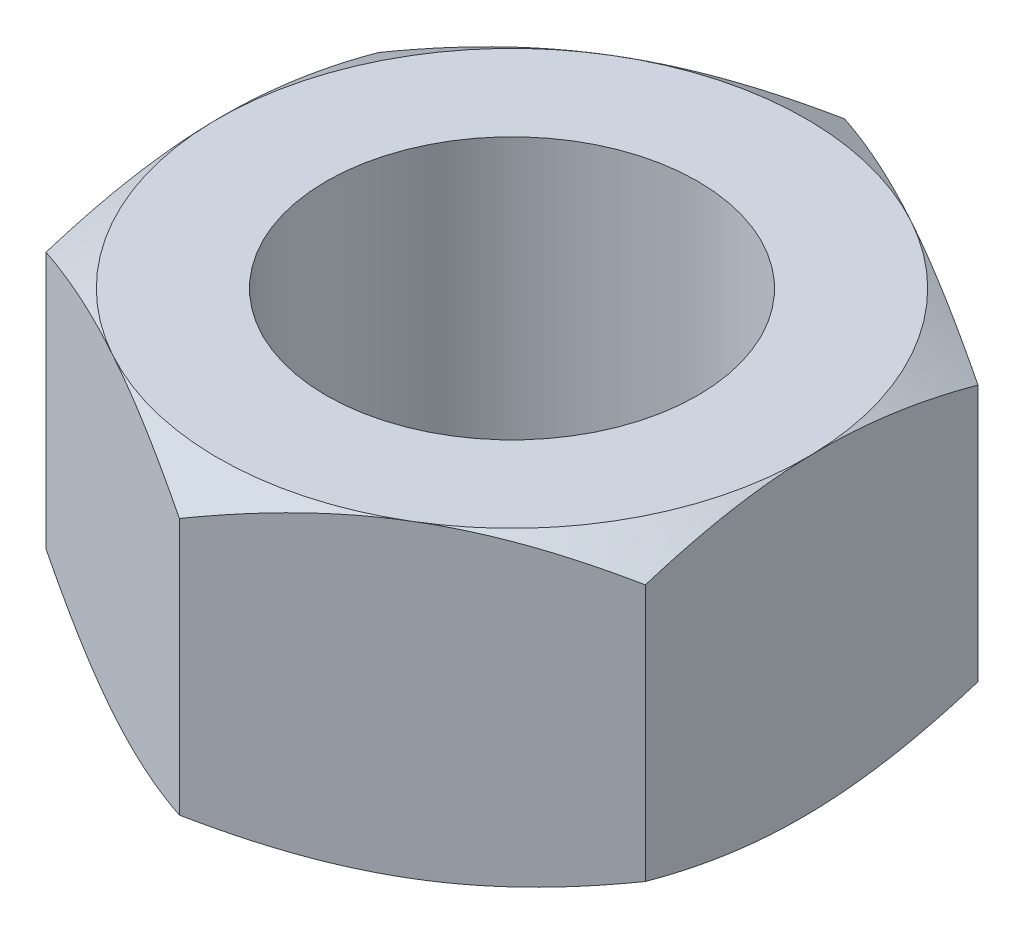
ISO-10303-21;
HEADER;
FILE_DESCRIPTION(('STEP AP214'),'2;1');
FILE_NAME('part.step','',(''),(''),'','','');
FILE_SCHEMA(('AUTOMOTIVE_DESIGN { 1 0 10303 214 1 1 1 1 }'));
ENDSEC;
DATA;
#1=APPLICATION_CONTEXT('core data for automotive mechanical design processes');
#2=APPLICATION_PROTOCOL_DEFINITION('international standard','automotive_design',2000,#1);
#3=PRODUCT_CONTEXT('',#1,'mechanical');
#4=PRODUCT('Part','Part','',(#3));
#5=PRODUCT_RELATED_PRODUCT_CATEGORY('part','',(#4));
#6=PRODUCT_DEFINITION_FORMATION('','',#4);
#7=PRODUCT_DEFINITION_CONTEXT('part definition',#1,'design');
#8=PRODUCT_DEFINITION('design','',#6,#7);
#9=PRODUCT_DEFINITION_SHAPE('','',#8);
#10=(LENGTH_UNIT() NAMED_UNIT(*) SI_UNIT(.MILLI.,.METRE.));
#11=(NAMED_UNIT(*) PLANE_ANGLE_UNIT() SI_UNIT($,.RADIAN.));
#12=(NAMED_UNIT(*) SI_UNIT($,.STERADIAN.) SOLID_ANGLE_UNIT());
#13=UNCERTAINTY_MEASURE_WITH_UNIT(LENGTH_MEASURE(1.E-05),#10,'distance_accuracy_value','');
#14=(GEOMETRIC_REPRESENTATION_CONTEXT(3) GLOBAL_UNCERTAINTY_ASSIGNED_CONTEXT((#13)) GLOBAL_UNIT_ASSIGNED_CONTEXT((#10,
#11,#12)) REPRESENTATION_CONTEXT('',''));
#15=CARTESIAN_POINT('',(0.,0.,0.));
#16=DIRECTION('',(0.,0.,1.));
#17=DIRECTION('',(1.,0.,0.));
#18=AXIS2_PLACEMENT_3D('',#15,#16,#17);
#19=CARTESIAN_POINT('',(0.216875664848166,10.,10.9675110339279));
#20=DIRECTION('',(-0.517024035207365,0.,-0.855970879772141));
#21=DIRECTION('',(-0.855970879772141,0.,0.517024035207365));
#22=AXIS2_PLACEMENT_3D('',#19,#20,#21);
#23=PLANE('',#22);
#24=CARTESIAN_POINT('',(9.60678100409177,0.848573226865303,5.29581487762493));
#25=CARTESIAN_POINT('',(9.40037473120608,0.778974190042007,5.42048851620465));
#26=CARTESIAN_POINT('',(9.1931988678912,0.712534024586031,5.5456270032489));
#27=CARTESIAN_POINT('',(8.7771857435893,0.586847930121857,5.79690749573838));
#28=CARTESIAN_POINT('',(8.56834796009741,0.527604367284288,5.92304981678729));
#29=CARTESIAN_POINT('',(7.93846959279282,0.361815083890065,6.30350931938198));
#30=CARTESIAN_POINT('',(7.51494247690453,0.267514877380496,6.55932841749732));
#31=CARTESIAN_POINT('',(6.88115353548772,0.156939031034355,6.9421499873717));
#32=CARTESIAN_POINT('',(6.67278520234029,0.125440116280293,7.06800875074691));
#33=CARTESIAN_POINT('',(6.25508380012184,0.0726184202625654,7.32030899785841));
#34=CARTESIAN_POINT('',(6.04575071256091,0.0512958348580953,7.44675049276298));
#35=CARTESIAN_POINT('',(5.62673535295866,0.0193731339503564,7.69984439718773));
#36=CARTESIAN_POINT('',(5.41705379387379,0.00876027643461872,7.82649637606754));
#37=CARTESIAN_POINT('',(4.99749699164288,-0.0015174559967477,8.07991732298792));
#38=CARTESIAN_POINT('',(4.78762175468121,-0.00118266915966374,8.20668628729299));
#39=CARTESIAN_POINT('',(4.39525467289056,0.0096732951475957,8.44368408325066));
#40=CARTESIAN_POINT('',(4.21273513521962,0.0188701791772939,8.55392964194996));
#41=CARTESIAN_POINT('',(3.84812293390536,0.0453652952509618,8.77416291864685));
#42=CARTESIAN_POINT('',(3.66603030137456,0.0626641003756451,8.88415061785184));
#43=CARTESIAN_POINT('',(3.12045797018203,0.126304408743109,9.21368753883417));
#44=CARTESIAN_POINT('',(2.75794397384888,0.184381876151889,9.43265345652194));
#45=CARTESIAN_POINT('',(2.02907057290985,0.329576142044076,9.8729079976684));
#46=CARTESIAN_POINT('',(1.66280418860713,0.417308400607521,10.0941404349488));
#47=CARTESIAN_POINT('',(0.935733335316184,0.616424218568323,10.5333062002026));
#48=CARTESIAN_POINT('',(0.574919555924859,0.727761012261039,10.7512451518513));
#49=CARTESIAN_POINT('',(0.216675664848164,0.848573226865303,10.9676318380457));
#50=B_SPLINE_CURVE_WITH_KNOTS('',3,(#24,#25,#26,#27,#28,#29,#30,#31,#32,#33,#34,#35,#36,#37,#38,
#39,#40,#41,#42,#43,#44,#45,#46,#47,#48,#49),.UNSPECIFIED.,.F.,.F.,(4,2,2,2,2,2,2,2,2,2,2,2,4),
(0.,0.752880596077925,1.50600806554758,3.01546907763463,3.75167382649358,4.48789274418008,
5.22323470119853,5.95855393851772,6.59868216032325,7.23885566775307,8.52011241106995,
9.82978447874759,11.1368856527152),.UNSPECIFIED.);
#51=CARTESIAN_POINT('',(9.60658100409177,0.848505776031884,5.29593568174279));
#52=VERTEX_POINT('',#51);
#53=CARTESIAN_POINT('',(4.91172833446997,0.,8.13172335783534));
#54=VERTEX_POINT('',#53);
#55=EDGE_CURVE('E128',#52,#54,#50,.T.);
#56=ORIENTED_EDGE('',*,*,#55,.F.);
#57=DIRECTION('',(0.,-1.,0.));
#58=VECTOR('',#57,1.);
#59=CARTESIAN_POINT('',(9.60658100409177,10.,5.29593568174279));
#60=LINE('',#59,#58);
#61=CARTESIAN_POINT('',(9.60658100409177,9.15149422396812,5.29593568174279));
#62=VERTEX_POINT('',#61);
#63=EDGE_CURVE('E333',#62,#52,#60,.T.);
#64=ORIENTED_EDGE('',*,*,#63,.F.);
#65=CARTESIAN_POINT('',(0.216675664848166,9.1514267731347,10.9676318380457));
#66=CARTESIAN_POINT('',(0.423081937733855,9.221025809958,10.842958199466));
#67=CARTESIAN_POINT('',(0.630257801048731,9.28746597541397,10.7178197124218));
#68=CARTESIAN_POINT('',(1.04627092535063,9.41315206987815,10.4665392199323));
#69=CARTESIAN_POINT('',(1.25510870884253,9.47239563271572,10.3403968988834));
#70=CARTESIAN_POINT('',(1.88498707614712,9.63818491610994,9.95993739628869));
#71=CARTESIAN_POINT('',(2.30851419203541,9.73248512261951,9.70411829817336));
#72=CARTESIAN_POINT('',(2.94230313345222,9.84306096896565,9.32129672829898));
#73=CARTESIAN_POINT('',(3.15067146659964,9.87455988371971,9.19543796492377));
#74=CARTESIAN_POINT('',(3.56837286881809,9.92738157973744,8.94313771781227));
#75=CARTESIAN_POINT('',(3.77770595637902,9.94870416514191,8.8166962229077));
#76=CARTESIAN_POINT('',(4.19672131598127,9.98062686604965,8.56360231848294));
#77=CARTESIAN_POINT('',(4.40640287506614,9.99123972356539,8.43695033960314));
#78=CARTESIAN_POINT('',(4.82595967729706,10.0015174559968,8.18352939268276));
#79=CARTESIAN_POINT('',(5.03583491425872,10.0011826691597,8.05676042837768));
#80=CARTESIAN_POINT('',(5.42820199604937,9.99032670485241,7.81976263242002));
#81=CARTESIAN_POINT('',(5.61072153372032,9.98112982082271,7.70951707372071));
#82=CARTESIAN_POINT('',(5.97533373503458,9.95463470474904,7.48928379702382));
#83=CARTESIAN_POINT('',(6.15742636756538,9.93733589962436,7.37929609781884));
#84=CARTESIAN_POINT('',(6.7029986987579,9.8736955912569,7.0497591768365));
#85=CARTESIAN_POINT('',(7.06551269509105,9.81561812384812,6.83079325914874));
#86=CARTESIAN_POINT('',(7.79438609603009,9.67042385795593,6.39053871800228));
#87=CARTESIAN_POINT('',(8.1606524803328,9.58269159939248,6.16930628072192));
#88=CARTESIAN_POINT('',(8.88772333362375,9.38357578143168,5.73014051546807));
#89=CARTESIAN_POINT('',(9.24853711301508,9.27223898773897,5.5122015638194));
#90=CARTESIAN_POINT('',(9.60678100409177,9.1514267731347,5.29581487762493));
#91=B_SPLINE_CURVE_WITH_KNOTS('',3,(#65,#66,#67,#68,#69,#70,#71,#72,#73,#74,#75,#76,#77,#78,#79,
#80,#81,#82,#83,#84,#85,#86,#87,#88,#89,#90),.UNSPECIFIED.,.F.,.F.,(4,2,2,2,2,2,2,2,2,2,2,2,4),
(0.,0.752880596077923,1.50600806554758,3.01546907763463,3.75167382649358,4.48789274418008,
5.22323470119853,5.95855393851772,6.59868216032325,7.23885566775307,8.52011241106995,
9.82978447874759,11.1368856527152),.UNSPECIFIED.);
#92=CARTESIAN_POINT('',(4.91172833446997,10.,8.13172335783534));
#93=VERTEX_POINT('',#92);
#94=EDGE_CURVE('E301',#93,#62,#91,.T.);
#95=ORIENTED_EDGE('',*,*,#94,.F.);
#96=CARTESIAN_POINT('',(0.216875664848166,9.15149422396812,10.9675110339279));
#97=VERTEX_POINT('',#96);
#98=EDGE_CURVE('E338',#97,#93,#91,.T.);
#99=ORIENTED_EDGE('',*,*,#98,.F.);
#100=DIRECTION('',(0.,-1.,0.));
#101=VECTOR('',#100,1.);
#102=CARTESIAN_POINT('',(0.216875664848166,10.,10.9675110339279));
#103=LINE('',#102,#101);
#104=CARTESIAN_POINT('',(0.216875664848166,0.848505776031884,10.9675110339279));
#105=VERTEX_POINT('',#104);
#106=EDGE_CURVE('E158',#97,#105,#103,.T.);
#107=ORIENTED_EDGE('',*,*,#106,.T.);
#108=EDGE_CURVE('E140',#54,#105,#50,.T.);
#109=ORIENTED_EDGE('',*,*,#108,.F.);
#110=EDGE_LOOP('',(#56,#64,#95,#99,#107,#109));
#111=FACE_BOUND('',#110,.T.);
#112=ADVANCED_FACE('F39',(#111),#23,.F.);
#113=CARTESIAN_POINT('',(9.60658100409177,10.,5.29593568174279));
#114=DIRECTION('',(-0.999804544386072,0.,0.0197705089706474));
#115=DIRECTION('',(0.0197705089706474,0.,0.999804544386072));
#116=AXIS2_PLACEMENT_3D('',#113,#114,#115);
#117=PLANE('',#116);
#118=CARTESIAN_POINT('',(9.38970138436881,0.848563523135423,-5.6717753521851));
#119=CARTESIAN_POINT('',(9.39446878052231,0.778964887805502,-5.4306857400646));
#120=CARTESIAN_POINT('',(9.39925395201297,0.71252513355252,-5.18869722023793));
#121=CARTESIAN_POINT('',(9.408862668471,0.586839879300845,-4.7027796146407));
#122=CARTESIAN_POINT('',(9.41368622550671,0.527596745477108,-4.45884991856806));
#123=CARTESIAN_POINT('',(9.42823461833804,0.36180877912364,-3.72313040381638));
#124=CARTESIAN_POINT('',(9.4380168857359,0.267509483360443,-3.22843624023668));
#125=CARTESIAN_POINT('',(9.45265560097675,0.156934994078659,-2.48814907598083));
#126=CARTESIAN_POINT('',(9.4574683149935,0.12543652317208,-2.24476771680992));
#127=CARTESIAN_POINT('',(9.46711602535614,0.0726157106484589,-1.75687816991915));
#128=CARTESIAN_POINT('',(9.4719510221291,0.0512935648955284,-1.51236996060221));
#129=CARTESIAN_POINT('',(9.48162908055074,0.0193717277397752,-1.0229456971624));
#130=CARTESIAN_POINT('',(9.4864721257328,0.00875929450104707,-0.778030475764933));
#131=CARTESIAN_POINT('',(9.496162689278,-0.00151761504700969,-0.287973821961096));
#132=CARTESIAN_POINT('',(9.50101020749831,-0.00118242961643562,-0.0428323967780148));
#133=CARTESIAN_POINT('',(9.51007272238568,0.00967419464952601,0.415463521724114));
#134=CARTESIAN_POINT('',(9.51428835876128,0.0188712596930642,0.628650365424909));
#135=CARTESIAN_POINT('',(9.52270977198597,0.0453665418380498,1.05452545163017));
#136=CARTESIAN_POINT('',(9.52691554811647,0.0626653319864503,1.26721365779562));
#137=CARTESIAN_POINT('',(9.53951657999838,0.126305310405615,1.90445415363683));
#138=CARTESIAN_POINT('',(9.54788953113672,0.184382177745448,2.32787848785426));
#139=CARTESIAN_POINT('',(9.56472424871673,0.329574569129725,3.17921859067769));
#140=CARTESIAN_POINT('',(9.57318386674029,0.417305529116223,3.60702571270414));
#141=CARTESIAN_POINT('',(9.58997695139023,0.616418256553656,4.45626041739451));
#142=CARTESIAN_POINT('',(9.59831063304857,0.727753260750373,4.87769887433292));
#143=CARTESIAN_POINT('',(9.60658495896657,0.848563523135419,5.29613568174279));
#144=B_SPLINE_CURVE_WITH_KNOTS('',3,(#118,#119,#120,#121,#122,#123,#124,#125,#126,#127,#128,
#129,#130,#131,#132,#133,#134,#135,#136,#137,#138,#139,#140,#141,#142,#143),.UNSPECIFIED.,.F.,
.F.,(4,2,2,2,2,2,2,2,2,2,2,2,4),(0.,0.75287944605367,1.50600576496928,3.01546441249885,
3.75166812041369,4.48788599749745,5.22322692609857,5.9585451341185,6.59866591508638,
7.23883197957973,8.52007379146588,9.8297301377129,11.1368157017217),.UNSPECIFIED.);
#145=CARTESIAN_POINT('',(9.3897053392436,0.848505776031888,-5.6715753521851));
#146=VERTEX_POINT('',#145);
#147=CARTESIAN_POINT('',(9.49814317166768,0.,-0.18781983522115));
#148=VERTEX_POINT('',#147);
#149=EDGE_CURVE('E55',#146,#148,#144,.T.);
#150=ORIENTED_EDGE('',*,*,#149,.F.);
#151=DIRECTION('',(0.,-1.,0.));
#152=VECTOR('',#151,1.);
#153=CARTESIAN_POINT('',(9.3897053392436,10.,-5.6715753521851));
#154=LINE('',#153,#152);
#155=CARTESIAN_POINT('',(9.3897053392436,9.15149422396812,-5.6715753521851));
#156=VERTEX_POINT('',#155);
#157=EDGE_CURVE('E297',#156,#146,#154,.T.);
#158=ORIENTED_EDGE('',*,*,#157,.F.);
#159=CARTESIAN_POINT('',(9.60658495896657,9.15143647686459,5.29613568174279));
#160=CARTESIAN_POINT('',(9.60181756281307,9.22103511219451,5.05504606962228));
#161=CARTESIAN_POINT('',(9.59703239132241,9.28747486644749,4.81305754979561));
#162=CARTESIAN_POINT('',(9.58742367486438,9.41316012069916,4.32713994419839));
#163=CARTESIAN_POINT('',(9.58260011782867,9.4724032545229,4.08321024812575));
#164=CARTESIAN_POINT('',(9.56805172499733,9.63819122087637,3.34749073337407));
#165=CARTESIAN_POINT('',(9.55826945759948,9.73249051663957,2.85279656979437));
#166=CARTESIAN_POINT('',(9.54363074235862,9.84306500592135,2.11250940553852));
#167=CARTESIAN_POINT('',(9.53881802834188,9.87456347682793,1.86912804636761));
#168=CARTESIAN_POINT('',(9.52917031797923,9.92738428935155,1.38123849947684));
#169=CARTESIAN_POINT('',(9.52433532120627,9.94870643510448,1.1367302901599));
#170=CARTESIAN_POINT('',(9.51465726278463,9.98062827226023,0.647306026720087));
#171=CARTESIAN_POINT('',(9.50981421760258,9.99124070549896,0.402390805322622));
#172=CARTESIAN_POINT('',(9.50012365405738,10.001517615047,-0.0876658484812139));
#173=CARTESIAN_POINT('',(9.49527613583707,10.0011824296164,-0.332807273664295));
#174=CARTESIAN_POINT('',(9.4862136209497,9.99032580535048,-0.791103192166424));
#175=CARTESIAN_POINT('',(9.48199798457409,9.98112874030694,-1.00429003586722));
#176=CARTESIAN_POINT('',(9.4735765713494,9.95463345816195,-1.43016512207248));
#177=CARTESIAN_POINT('',(9.4693707952189,9.93733466801356,-1.64285332823793));
#178=CARTESIAN_POINT('',(9.45676976333699,9.87369468959439,-2.28009382407914));
#179=CARTESIAN_POINT('',(9.44839681219865,9.81561782225456,-2.70351815829657));
#180=CARTESIAN_POINT('',(9.43156209461865,9.67042543087028,-3.55485826112));
#181=CARTESIAN_POINT('',(9.42310247659508,9.58269447088378,-3.98266538314645));
#182=CARTESIAN_POINT('',(9.40630939194515,9.38358174344635,-4.83190008783682));
#183=CARTESIAN_POINT('',(9.39797571028681,9.27224673924963,-5.25333854477523));
#184=CARTESIAN_POINT('',(9.38970138436881,9.15143647686458,-5.6717753521851));
#185=B_SPLINE_CURVE_WITH_KNOTS('',3,(#159,#160,#161,#162,#163,#164,#165,#166,#167,#168,#169,
#170,#171,#172,#173,#174,#175,#176,#177,#178,#179,#180,#181,#182,#183,#184),.UNSPECIFIED.,.F.,
.F.,(4,2,2,2,2,2,2,2,2,2,2,2,4),(0.,0.75287944605367,1.50600576496928,3.01546441249884,
3.75166812041368,4.48788599749744,5.22322692609856,5.9585451341185,6.59866591508638,
7.23883197957972,8.52007379146588,9.8297301377129,11.1368157017217),.UNSPECIFIED.);
#186=CARTESIAN_POINT('',(9.49814317166769,10.,-0.18781983522115));
#187=VERTEX_POINT('',#186);
#188=EDGE_CURVE('E263',#187,#156,#185,.T.);
#189=ORIENTED_EDGE('',*,*,#188,.F.);
#190=EDGE_CURVE('E295',#62,#187,#185,.T.);
#191=ORIENTED_EDGE('',*,*,#190,.F.);
#192=ORIENTED_EDGE('',*,*,#63,.T.);
#193=EDGE_CURVE('E134',#148,#52,#144,.T.);
#194=ORIENTED_EDGE('',*,*,#193,.F.);
#195=EDGE_LOOP('',(#150,#158,#189,#191,#192,#194));
#196=FACE_BOUND('',#195,.T.);
#197=ADVANCED_FACE('F256',(#196),#117,.F.);
#198=CARTESIAN_POINT('',(9.3897053392436,10.,-5.6715753521851));
#199=DIRECTION('',(-0.482780509178707,0.,0.875741388742789));
#200=DIRECTION('',(0.875741388742789,0.,0.482780509178707));
#201=AXIS2_PLACEMENT_3D('',#198,#199,#200);
#202=PLANE('',#201);
#203=CARTESIAN_POINT('',(-0.217075664848166,0.848571704089125,-10.9676212903382));
#204=CARTESIAN_POINT('',(-0.00590202911106939,0.778972730270795,-10.8512050552523));
#205=CARTESIAN_POINT('',(0.206058972229,0.712532629343481,-10.7343547596418));
#206=CARTESIAN_POINT('',(0.631680745369998,0.586846666730947,-10.4997171154743));
#207=CARTESIAN_POINT('',(0.845342051743871,0.527603171217035,-10.3819294722169));
#208=CARTESIAN_POINT('',(1.48976870550596,0.361814094501477,-10.0266686246301));
#209=CARTESIAN_POINT('',(1.92307801500348,0.26751403091221,-9.78779297965073));
#210=CARTESIAN_POINT('',(2.57150556050246,0.156938397525556,-9.43032651226027));
#211=CARTESIAN_POINT('',(2.784686573261,0.125439552422968,-9.31280364625236));
#212=CARTESIAN_POINT('',(3.21203561497738,0.072617995048979,-9.07721378992154));
#213=CARTESIAN_POINT('',(3.42620366285223,0.0512954786375441,-8.95914678917003));
#214=CARTESIAN_POINT('',(3.85489700617724,0.0193729132755129,-8.72281584349085));
#215=CARTESIAN_POINT('',(4.06942157220824,0.0087601223401552,-8.6045523006789));
#216=CARTESIAN_POINT('',(4.49866885928968,-0.00151748095885387,-8.36791597574939));
#217=CARTESIAN_POINT('',(4.71339157401294,-0.00118263157180281,-8.24954319711991));
#218=CARTESIAN_POINT('',(5.11482083649081,0.00967343630109161,-8.02824244985647));
#219=CARTESIAN_POINT('',(5.30155571728474,0.0188703487371186,-7.92529886172648));
#220=CARTESIAN_POINT('',(5.67458874566047,0.0453654908725277,-7.71965244864756));
#221=CARTESIAN_POINT('',(5.86088686141136,0.0626642936473255,-7.61694964124643));
#222=CARTESIAN_POINT('',(6.41905934623556,0.126304550237773,-7.30923916884335));
#223=CARTESIAN_POINT('',(6.78994571064261,0.1843819234799,-7.10477617308049));
#224=CARTESIAN_POINT('',(7.53565264658703,0.329575895211713,-6.69368132377781));
#225=CARTESIAN_POINT('',(7.91037804992742,0.417307949993502,-6.48710193475683));
#226=CARTESIAN_POINT('',(8.65424081022072,0.616423282967979,-6.07702374639002));
#227=CARTESIAN_POINT('',(9.02338769253706,0.727759795840569,-5.8735196958823));
#228=CARTESIAN_POINT('',(9.38990533924361,0.848571704089125,-5.67146509577484));
#229=B_SPLINE_CURVE_WITH_KNOTS('',3,(#203,#204,#205,#206,#207,#208,#209,#210,#211,#212,#213,
#214,#215,#216,#217,#218,#219,#220,#221,#222,#223,#224,#225,#226,#227,#228),.UNSPECIFIED.,.F.,
.F.,(4,2,2,2,2,2,2,2,2,2,2,2,4),(0.,0.752880415608211,1.50600770452502,3.01546834554945,
3.75167293105627,4.48789168544422,5.22323348107632,5.95855255687078,6.59867961101138,
7.23885195044689,8.52010635062586,9.82977595119279,11.1368746755427),.UNSPECIFIED.);
#230=CARTESIAN_POINT('',(-0.216875664848166,0.848505776031888,-10.9675110339279));
#231=VERTEX_POINT('',#230);
#232=CARTESIAN_POINT('',(4.58641483719772,0.,-8.31954319305649));
#233=VERTEX_POINT('',#232);
#234=EDGE_CURVE('E62',#231,#233,#229,.T.);
#235=ORIENTED_EDGE('',*,*,#234,.F.);
#236=DIRECTION('',(0.,-1.,0.));
#237=VECTOR('',#236,1.);
#238=CARTESIAN_POINT('',(-0.216875664848166,10.,-10.9675110339279));
#239=LINE('',#238,#237);
#240=CARTESIAN_POINT('',(-0.216875664848166,9.15149422396812,-10.9675110339279));
#241=VERTEX_POINT('',#240);
#242=EDGE_CURVE('E324',#241,#231,#239,.T.);
#243=ORIENTED_EDGE('',*,*,#242,.F.);
#244=CARTESIAN_POINT('',(9.38990533924361,9.15142829591088,-5.67146509577485));
#245=CARTESIAN_POINT('',(9.17873170350651,9.22102726972921,-5.78788133086068));
#246=CARTESIAN_POINT('',(8.96677070216644,9.28746737065653,-5.90473162647123));
#247=CARTESIAN_POINT('',(8.54114892902544,9.41315333326906,-6.13936927063869));
#248=CARTESIAN_POINT('',(8.32748762265157,9.47239682878297,-6.25715691389608));
#249=CARTESIAN_POINT('',(7.68306096888948,9.63818590549853,-6.61241776148287));
#250=CARTESIAN_POINT('',(7.24975165939196,9.7324859690878,-6.85129340646227));
#251=CARTESIAN_POINT('',(6.60132411389298,9.84306160247445,-7.20875987385272));
#252=CARTESIAN_POINT('',(6.38814310113444,9.87456044757704,-7.32628273986063));
#253=CARTESIAN_POINT('',(5.96079405941806,9.92738200495103,-7.56187259619145));
#254=CARTESIAN_POINT('',(5.74662601154322,9.94870452136246,-7.67993959694297));
#255=CARTESIAN_POINT('',(5.3179326682182,9.98062708672449,-7.91627054262214));
#256=CARTESIAN_POINT('',(5.1034081021872,9.99123987765985,-8.0345340854341));
#257=CARTESIAN_POINT('',(4.67416081510576,10.0015174809589,-8.27117041036361));
#258=CARTESIAN_POINT('',(4.4594381003825,10.0011826315718,-8.38954318899309));
#259=CARTESIAN_POINT('',(4.05800883790463,9.99032656369891,-8.61084393625653));
#260=CARTESIAN_POINT('',(3.8712739571107,9.98112965126289,-8.71378752438651));
#261=CARTESIAN_POINT('',(3.49824092873497,9.95463450912748,-8.91943393746544));
#262=CARTESIAN_POINT('',(3.31194281298408,9.93733570635268,-9.02213674486657));
#263=CARTESIAN_POINT('',(2.75377032815988,9.87369544976223,-9.32984721726964));
#264=CARTESIAN_POINT('',(2.38288396375283,9.8156180765201,-9.53431021303251));
#265=CARTESIAN_POINT('',(1.63717702780842,9.67042410478829,-9.94540506233519));
#266=CARTESIAN_POINT('',(1.26245162446802,9.5826920500065,-10.1519844513562));
#267=CARTESIAN_POINT('',(0.518588864174721,9.38357671703203,-10.562062639723));
#268=CARTESIAN_POINT('',(0.149441981858385,9.27224020415944,-10.7655666902307));
#269=CARTESIAN_POINT('',(-0.217075664848166,9.15142829591088,-10.9676212903382));
#270=B_SPLINE_CURVE_WITH_KNOTS('',3,(#244,#245,#246,#247,#248,#249,#250,#251,#252,#253,#254,
#255,#256,#257,#258,#259,#260,#261,#262,#263,#264,#265,#266,#267,#268,#269),.UNSPECIFIED.,.F.,
.F.,(4,2,2,2,2,2,2,2,2,2,2,2,4),(0.,0.752880415608211,1.50600770452502,3.01546834554945,
3.75167293105627,4.48789168544422,5.22323348107632,5.95855255687078,6.59867961101137,
7.23885195044689,8.52010635062586,9.82977595119279,11.1368746755427),.UNSPECIFIED.);
#271=CARTESIAN_POINT('',(4.58641483719772,10.,-8.3195431930565));
#272=VERTEX_POINT('',#271);
#273=EDGE_CURVE('E242',#272,#241,#270,.T.);
#274=ORIENTED_EDGE('',*,*,#273,.F.);
#275=EDGE_CURVE('E300',#156,#272,#270,.T.);
#276=ORIENTED_EDGE('',*,*,#275,.F.);
#277=ORIENTED_EDGE('',*,*,#157,.T.);
#278=EDGE_CURVE('E193',#233,#146,#229,.T.);
#279=ORIENTED_EDGE('',*,*,#278,.F.);
#280=EDGE_LOOP('',(#235,#243,#274,#276,#277,#279));
#281=FACE_BOUND('',#280,.T.);
#282=ADVANCED_FACE('F251',(#281),#202,.F.);
#283=CARTESIAN_POINT('',(-0.216875664848166,10.,-10.9675110339279));
#284=DIRECTION('',(0.517024035207365,0.,0.855970879772141));
#285=DIRECTION('',(0.855970879772141,0.,-0.517024035207365));
#286=AXIS2_PLACEMENT_3D('',#283,#284,#285);
#287=PLANE('',#286);
#288=CARTESIAN_POINT('',(-9.60678100409178,0.848573226865308,-5.29581487762494));
#289=CARTESIAN_POINT('',(-9.40037473120609,0.778974190042012,-5.42048851620465));
#290=CARTESIAN_POINT('',(-9.19319886789121,0.712534024586036,-5.54562700324891));
#291=CARTESIAN_POINT('',(-8.77718574358931,0.586847930121862,-5.79690749573838));
#292=CARTESIAN_POINT('',(-8.56834796009741,0.527604367284293,-5.9230498167873));
#293=CARTESIAN_POINT('',(-7.93846959279282,0.361815083890069,-6.30350931938199));
#294=CARTESIAN_POINT('',(-7.51494247690453,0.2675148773805,-6.55932841749733));
#295=CARTESIAN_POINT('',(-6.88115353548772,0.156939031034359,-6.9421499873717));
#296=CARTESIAN_POINT('',(-6.6727852023403,0.125440116280298,-7.06800875074692));
#297=CARTESIAN_POINT('',(-6.25508380012185,0.0726184202625697,-7.32030899785841));
#298=CARTESIAN_POINT('',(-6.04575071256092,0.0512958348580984,-7.44675049276298));
#299=CARTESIAN_POINT('',(-5.62673535295866,0.0193731339503593,-7.69984439718774));
#300=CARTESIAN_POINT('',(-5.41705379387379,0.00876027643462235,-7.82649637606754));
#301=CARTESIAN_POINT('',(-4.99749699164288,-0.00151745599674382,-8.07991732298792));
#302=CARTESIAN_POINT('',(-4.78762175468121,-0.00118266915966044,-8.206686287293));
#303=CARTESIAN_POINT('',(-4.39525467289057,0.00967329514759891,-8.44368408325066));
#304=CARTESIAN_POINT('',(-4.21273513521962,0.0188701791772974,-8.55392964194997));
#305=CARTESIAN_POINT('',(-3.84812293390536,0.0453652952509658,-8.77416291864686));
#306=CARTESIAN_POINT('',(-3.66603030137456,0.0626641003756493,-8.88415061785185));
#307=CARTESIAN_POINT('',(-3.12045797018203,0.126304408743114,-9.21368753883418));
#308=CARTESIAN_POINT('',(-2.75794397384888,0.184381876151893,-9.43265345652195));
#309=CARTESIAN_POINT('',(-2.02907057290985,0.32957614204408,-9.87290799766841));
#310=CARTESIAN_POINT('',(-1.66280418860713,0.417308400607525,-10.0941404349488));
#311=CARTESIAN_POINT('',(-0.935733335316184,0.616424218568327,-10.5333062002026));
#312=CARTESIAN_POINT('',(-0.574919555924859,0.727761012261044,-10.7512451518513));
#313=CARTESIAN_POINT('',(-0.216675664848165,0.848573226865307,-10.9676318380458));
#314=B_SPLINE_CURVE_WITH_KNOTS('',3,(#288,#289,#290,#291,#292,#293,#294,#295,#296,#297,#298,
#299,#300,#301,#302,#303,#304,#305,#306,#307,#308,#309,#310,#311,#312,#313),.UNSPECIFIED.,.F.,
.F.,(4,2,2,2,2,2,2,2,2,2,2,2,4),(0.,0.752880596077923,1.50600806554758,3.01546907763463,
3.75167382649358,4.48789274418009,5.22323470119853,5.95855393851772,6.59868216032326,
7.23885566775308,8.52011241106996,9.8297844787476,11.1368856527152),.UNSPECIFIED.);
#315=CARTESIAN_POINT('',(-9.60658100409177,0.848505776031889,-5.29593568174279));
#316=VERTEX_POINT('',#315);
#317=CARTESIAN_POINT('',(-4.91172833446997,0.,-8.13172335783534));
#318=VERTEX_POINT('',#317);
#319=EDGE_CURVE('E173',#316,#318,#314,.T.);
#320=ORIENTED_EDGE('',*,*,#319,.F.);
#321=DIRECTION('',(0.,-1.,0.));
#322=VECTOR('',#321,1.);
#323=CARTESIAN_POINT('',(-9.60658100409177,10.,-5.29593568174279));
#324=LINE('',#323,#322);
#325=CARTESIAN_POINT('',(-9.60658100409177,9.15149422396812,-5.29593568174279));
#326=VERTEX_POINT('',#325);
#327=EDGE_CURVE('E321',#326,#316,#324,.T.);
#328=ORIENTED_EDGE('',*,*,#327,.F.);
#329=CARTESIAN_POINT('',(-0.216675664848166,9.1514267731347,-10.9676318380458));
#330=CARTESIAN_POINT('',(-0.423081937733855,9.22102580995799,-10.842958199466));
#331=CARTESIAN_POINT('',(-0.630257801048732,9.28746597541397,-10.7178197124218));
#332=CARTESIAN_POINT('',(-1.04627092535063,9.41315206987815,-10.4665392199323));
#333=CARTESIAN_POINT('',(-1.25510870884253,9.47239563271571,-10.3403968988834));
#334=CARTESIAN_POINT('',(-1.88498707614712,9.63818491610994,-9.9599373962887));
#335=CARTESIAN_POINT('',(-2.30851419203541,9.73248512261951,-9.70411829817336));
#336=CARTESIAN_POINT('',(-2.94230313345222,9.84306096896564,-9.32129672829899));
#337=CARTESIAN_POINT('',(-3.15067146659964,9.87455988371971,-9.19543796492377));
#338=CARTESIAN_POINT('',(-3.56837286881809,9.92738157973744,-8.94313771781228));
#339=CARTESIAN_POINT('',(-3.77770595637902,9.94870416514191,-8.81669622290771));
#340=CARTESIAN_POINT('',(-4.19672131598128,9.98062686604965,-8.56360231848295));
#341=CARTESIAN_POINT('',(-4.40640287506615,9.99123972356538,-8.43695033960315));
#342=CARTESIAN_POINT('',(-4.82595967729706,10.0015174559967,-8.18352939268277));
#343=CARTESIAN_POINT('',(-5.03583491425873,10.0011826691597,-8.05676042837769));
#344=CARTESIAN_POINT('',(-5.42820199604938,9.99032670485241,-7.81976263242003));
#345=CARTESIAN_POINT('',(-5.61072153372032,9.98112982082271,-7.70951707372072));
#346=CARTESIAN_POINT('',(-5.97533373503458,9.95463470474904,-7.48928379702383));
#347=CARTESIAN_POINT('',(-6.15742636756538,9.93733589962436,-7.37929609781884));
#348=CARTESIAN_POINT('',(-6.70299869875791,9.87369559125689,-7.04975917683651));
#349=CARTESIAN_POINT('',(-7.06551269509106,9.81561812384811,-6.83079325914874));
#350=CARTESIAN_POINT('',(-7.79438609603009,9.67042385795593,-6.39053871800228));
#351=CARTESIAN_POINT('',(-8.16065248033281,9.58269159939248,-6.16930628072193));
#352=CARTESIAN_POINT('',(-8.88772333362376,9.38357578143168,-5.73014051546807));
#353=CARTESIAN_POINT('',(-9.24853711301508,9.27223898773896,-5.51220156381941));
#354=CARTESIAN_POINT('',(-9.60678100409178,9.1514267731347,-5.29581487762494));
#355=B_SPLINE_CURVE_WITH_KNOTS('',3,(#329,#330,#331,#332,#333,#334,#335,#336,#337,#338,#339,
#340,#341,#342,#343,#344,#345,#346,#347,#348,#349,#350,#351,#352,#353,#354),.UNSPECIFIED.,.F.,
.F.,(4,2,2,2,2,2,2,2,2,2,2,2,4),(0.,0.752880596077923,1.50600806554758,3.01546907763463,
3.75167382649358,4.48789274418009,5.22323470119853,5.95855393851772,6.59868216032325,
7.23885566775307,8.52011241106996,9.8297844787476,11.1368856527152),.UNSPECIFIED.);
#356=CARTESIAN_POINT('',(-4.91172833446997,10.,-8.13172335783535));
#357=VERTEX_POINT('',#356);
#358=EDGE_CURVE('E235',#357,#326,#355,.T.);
#359=ORIENTED_EDGE('',*,*,#358,.F.);
#360=EDGE_CURVE('E241',#241,#357,#355,.T.);
#361=ORIENTED_EDGE('',*,*,#360,.F.);
#362=ORIENTED_EDGE('',*,*,#242,.T.);
#363=EDGE_CURVE('E273',#318,#231,#314,.T.);
#364=ORIENTED_EDGE('',*,*,#363,.F.);
#365=EDGE_LOOP('',(#320,#328,#359,#361,#362,#364));
#366=FACE_BOUND('',#365,.T.);
#367=ADVANCED_FACE('F248',(#366),#287,.F.);
#368=CARTESIAN_POINT('',(-9.60658100409177,10.,-5.29593568174279));
#369=DIRECTION('',(0.999804544386072,0.,-0.0197705089706477));
#370=DIRECTION('',(-0.0197705089706477,0.,-0.999804544386072));
#371=AXIS2_PLACEMENT_3D('',#368,#369,#370);
#372=PLANE('',#371);
#373=CARTESIAN_POINT('',(-9.38970138436881,0.848563523135423,5.6717753521851));
#374=CARTESIAN_POINT('',(-9.39446878052231,0.778964887805502,5.43068574006459));
#375=CARTESIAN_POINT('',(-9.39925395201297,0.71252513355252,5.18869722023792));
#376=CARTESIAN_POINT('',(-9.408862668471,0.586839879300845,4.7027796146407));
#377=CARTESIAN_POINT('',(-9.41368622550671,0.527596745477109,4.45884991856805));
#378=CARTESIAN_POINT('',(-9.42823461833804,0.36180877912364,3.72313040381638));
#379=CARTESIAN_POINT('',(-9.4380168857359,0.267509483360443,3.22843624023667));
#380=CARTESIAN_POINT('',(-9.45265560097675,0.156934994078659,2.48814907598083));
#381=CARTESIAN_POINT('',(-9.4574683149935,0.12543652317208,2.24476771680992));
#382=CARTESIAN_POINT('',(-9.46711602535614,0.0726157106484596,1.75687816991915));
#383=CARTESIAN_POINT('',(-9.4719510221291,0.0512935648955289,1.5123699606022));
#384=CARTESIAN_POINT('',(-9.48162908055074,0.0193717277397763,1.02294569716239));
#385=CARTESIAN_POINT('',(-9.4864721257328,0.00875929450104878,0.778030475764928));
#386=CARTESIAN_POINT('',(-9.496162689278,-0.00151761504700748,0.287973821961091));
#387=CARTESIAN_POINT('',(-9.50101020749831,-0.00118242961643353,0.0428323967780098));
#388=CARTESIAN_POINT('',(-9.51007272238568,0.0096741946495281,-0.415463521724119));
#389=CARTESIAN_POINT('',(-9.51428835876129,0.0188712596930664,-0.628650365424913));
#390=CARTESIAN_POINT('',(-9.52270977198598,0.0453665418380521,-1.05452545163017));
#391=CARTESIAN_POINT('',(-9.52691554811648,0.0626653319864525,-1.26721365779563));
#392=CARTESIAN_POINT('',(-9.53951657999839,0.126305310405617,-1.90445415363683));
#393=CARTESIAN_POINT('',(-9.54788953113673,0.184382177745452,-2.32787848785426));
#394=CARTESIAN_POINT('',(-9.56472424871673,0.329574569129729,-3.17921859067769));
#395=CARTESIAN_POINT('',(-9.5731838667403,0.417305529116227,-3.60702571270414));
#396=CARTESIAN_POINT('',(-9.58997695139023,0.616418256553661,-4.45626041739452));
#397=CARTESIAN_POINT('',(-9.59831063304858,0.727753260750378,-4.87769887433292));
#398=CARTESIAN_POINT('',(-9.60658495896657,0.848563523135424,-5.29613568174279));
#399=B_SPLINE_CURVE_WITH_KNOTS('',3,(#373,#374,#375,#376,#377,#378,#379,#380,#381,#382,#383,
#384,#385,#386,#387,#388,#389,#390,#391,#392,#393,#394,#395,#396,#397,#398),.UNSPECIFIED.,.F.,
.F.,(4,2,2,2,2,2,2,2,2,2,2,2,4),(0.,0.752879446053671,1.50600576496929,3.01546441249885,
3.75166812041369,4.48788599749745,5.22322692609857,5.9585451341185,6.59866591508638,
7.23883197957973,8.52007379146589,9.82973013771291,11.1368157017217),.UNSPECIFIED.);
#400=CARTESIAN_POINT('',(-9.38970533924361,0.848505776031887,5.6715753521851));
#401=VERTEX_POINT('',#400);
#402=CARTESIAN_POINT('',(-9.49814317166768,0.,0.187819835221153));
#403=VERTEX_POINT('',#402);
#404=EDGE_CURVE('E159',#401,#403,#399,.T.);
#405=ORIENTED_EDGE('',*,*,#404,.F.);
#406=DIRECTION('',(0.,-1.,0.));
#407=VECTOR('',#406,1.);
#408=CARTESIAN_POINT('',(-9.38970533924361,10.,5.6715753521851));
#409=LINE('',#408,#407);
#410=CARTESIAN_POINT('',(-9.38970533924361,9.15149422396812,5.6715753521851));
#411=VERTEX_POINT('',#410);
#412=EDGE_CURVE('E325',#411,#401,#409,.T.);
#413=ORIENTED_EDGE('',*,*,#412,.F.);
#414=CARTESIAN_POINT('',(-9.60658495896657,9.15143647686458,-5.29613568174279));
#415=CARTESIAN_POINT('',(-9.60181756281307,9.2210351121945,-5.05504606962229));
#416=CARTESIAN_POINT('',(-9.59703239132241,9.28747486644749,-4.81305754979562));
#417=CARTESIAN_POINT('',(-9.58742367486438,9.41316012069916,-4.32713994419839));
#418=CARTESIAN_POINT('',(-9.58260011782867,9.4724032545229,-4.08321024812575));
#419=CARTESIAN_POINT('',(-9.56805172499734,9.63819122087636,-3.34749073337407));
#420=CARTESIAN_POINT('',(-9.55826945759948,9.73249051663956,-2.85279656979437));
#421=CARTESIAN_POINT('',(-9.54363074235863,9.84306500592134,-2.11250940553852));
#422=CARTESIAN_POINT('',(-9.53881802834188,9.87456347682792,-1.86912804636762));
#423=CARTESIAN_POINT('',(-9.52917031797924,9.92738428935155,-1.38123849947684));
#424=CARTESIAN_POINT('',(-9.52433532120628,9.94870643510448,-1.1367302901599));
#425=CARTESIAN_POINT('',(-9.51465726278464,9.98062827226023,-0.647306026720088));
#426=CARTESIAN_POINT('',(-9.50981421760258,9.99124070549896,-0.402390805322623));
#427=CARTESIAN_POINT('',(-9.50012365405738,10.001517615047,0.0876658484812134));
#428=CARTESIAN_POINT('',(-9.49527613583707,10.0011824296164,0.332807273664295));
#429=CARTESIAN_POINT('',(-9.4862136209497,9.99032580535048,0.791103192166423));
#430=CARTESIAN_POINT('',(-9.48199798457409,9.98112874030694,1.00429003586722));
#431=CARTESIAN_POINT('',(-9.47357657134941,9.95463345816195,1.43016512207248));
#432=CARTESIAN_POINT('',(-9.46937079521891,9.93733466801355,1.64285332823793));
#433=CARTESIAN_POINT('',(-9.456769763337,9.87369468959439,2.28009382407913));
#434=CARTESIAN_POINT('',(-9.44839681219866,9.81561782225455,2.70351815829656));
#435=CARTESIAN_POINT('',(-9.43156209461865,9.67042543087027,3.55485826112));
#436=CARTESIAN_POINT('',(-9.42310247659509,9.58269447088378,3.98266538314645));
#437=CARTESIAN_POINT('',(-9.40630939194515,9.38358174344635,4.83190008783682));
#438=CARTESIAN_POINT('',(-9.39797571028681,9.27224673924963,5.25333854477523));
#439=CARTESIAN_POINT('',(-9.38970138436881,9.15143647686458,5.6717753521851));
#440=B_SPLINE_CURVE_WITH_KNOTS('',3,(#414,#415,#416,#417,#418,#419,#420,#421,#422,#423,#424,
#425,#426,#427,#428,#429,#430,#431,#432,#433,#434,#435,#436,#437,#438,#439),.UNSPECIFIED.,.F.,
.F.,(4,2,2,2,2,2,2,2,2,2,2,2,4),(0.,0.752879446053672,1.50600576496928,3.01546441249885,
3.75166812041369,4.48788599749745,5.22322692609857,5.95854513411851,6.59866591508638,
7.23883197957973,8.52007379146589,9.82973013771291,11.1368157017217),.UNSPECIFIED.);
#441=CARTESIAN_POINT('',(-9.49814317166769,10.,0.187819835221153));
#442=VERTEX_POINT('',#441);
#443=EDGE_CURVE('E228',#442,#411,#440,.T.);
#444=ORIENTED_EDGE('',*,*,#443,.F.);
#445=EDGE_CURVE('E234',#326,#442,#440,.T.);
#446=ORIENTED_EDGE('',*,*,#445,.F.);
#447=ORIENTED_EDGE('',*,*,#327,.T.);
#448=EDGE_CURVE('E139',#403,#316,#399,.T.);
#449=ORIENTED_EDGE('',*,*,#448,.F.);
#450=EDGE_LOOP('',(#405,#413,#444,#446,#447,#449));
#451=FACE_BOUND('',#450,.T.);
#452=ADVANCED_FACE('F214',(#451),#372,.F.);
#453=CARTESIAN_POINT('',(-9.38970533924361,10.,5.6715753521851));
#454=DIRECTION('',(0.482780509178707,0.,-0.875741388742789));
#455=DIRECTION('',(-0.875741388742789,0.,-0.482780509178707));
#456=AXIS2_PLACEMENT_3D('',#453,#454,#455);
#457=PLANE('',#456);
#458=CARTESIAN_POINT('',(0.217075664848166,0.84857170408912,10.9676212903381));
#459=CARTESIAN_POINT('',(0.00590202911107026,0.77897273027079,10.8512050552523));
#460=CARTESIAN_POINT('',(-0.206058972228998,0.712532629343476,10.7343547596418));
#461=CARTESIAN_POINT('',(-0.631680745369996,0.586846666730942,10.4997171154743));
#462=CARTESIAN_POINT('',(-0.845342051743869,0.52760317121703,10.3819294722169));
#463=CARTESIAN_POINT('',(-1.48976870550596,0.361814094501472,10.0266686246301));
#464=CARTESIAN_POINT('',(-1.92307801500348,0.267514030912207,9.78779297965072));
#465=CARTESIAN_POINT('',(-2.57150556050246,0.156938397525553,9.43032651226027));
#466=CARTESIAN_POINT('',(-2.78468657326099,0.125439552422965,9.31280364625236));
#467=CARTESIAN_POINT('',(-3.21203561497738,0.0726179950489759,9.07721378992154));
#468=CARTESIAN_POINT('',(-3.42620366285222,0.0512954786375408,8.95914678917002));
#469=CARTESIAN_POINT('',(-3.85489700617724,0.0193729132755101,8.72281584349085));
#470=CARTESIAN_POINT('',(-4.06942157220824,0.00876012234015295,8.60455230067889));
#471=CARTESIAN_POINT('',(-4.49866885928968,-0.00151748095885612,8.36791597574939));
#472=CARTESIAN_POINT('',(-4.71339157401293,-0.00118263157180567,8.2495431971199));
#473=CARTESIAN_POINT('',(-5.11482083649081,0.00967343630108849,8.02824244985646));
#474=CARTESIAN_POINT('',(-5.30155571728474,0.0188703487371157,7.92529886172648));
#475=CARTESIAN_POINT('',(-5.67458874566047,0.045365490872525,7.71965244864755));
#476=CARTESIAN_POINT('',(-5.86088686141136,0.0626642936473227,7.61694964124642));
#477=CARTESIAN_POINT('',(-6.41905934623556,0.12630455023777,7.30923916884335));
#478=CARTESIAN_POINT('',(-6.78994571064261,0.184381923479897,7.10477617308049));
#479=CARTESIAN_POINT('',(-7.53565264658702,0.32957589521171,6.69368132377781));
#480=CARTESIAN_POINT('',(-7.91037804992742,0.4173079499935,6.48710193475683));
#481=CARTESIAN_POINT('',(-8.65424081022072,0.616423282967978,6.07702374639002));
#482=CARTESIAN_POINT('',(-9.02338769253705,0.727759795840568,5.87351969588229));
#483=CARTESIAN_POINT('',(-9.38990533924361,0.848571704089124,5.67146509577484));
#484=B_SPLINE_CURVE_WITH_KNOTS('',3,(#458,#459,#460,#461,#462,#463,#464,#465,#466,#467,#468,
#469,#470,#471,#472,#473,#474,#475,#476,#477,#478,#479,#480,#481,#482,#483),.UNSPECIFIED.,.F.,
.F.,(4,2,2,2,2,2,2,2,2,2,2,2,4),(0.,0.752880415608209,1.50600770452502,3.01546834554945,
3.75167293105627,4.48789168544421,5.22323348107632,5.95855255687077,6.59867961101137,
7.23885195044689,8.52010635062586,9.82977595119279,11.1368746755427),.UNSPECIFIED.);
#485=CARTESIAN_POINT('',(-4.58641483719772,0.,8.3195431930565));
#486=VERTEX_POINT('',#485);
#487=EDGE_CURVE('E146',#105,#486,#484,.T.);
#488=ORIENTED_EDGE('',*,*,#487,.F.);
#489=ORIENTED_EDGE('',*,*,#106,.F.);
#490=CARTESIAN_POINT('',(-9.38990533924361,9.15142829591088,5.67146509577484));
#491=CARTESIAN_POINT('',(-9.17873170350651,9.22102726972921,5.78788133086067));
#492=CARTESIAN_POINT('',(-8.96677070216644,9.28746737065653,5.90473162647122));
#493=CARTESIAN_POINT('',(-8.54114892902544,9.41315333326906,6.13936927063869));
#494=CARTESIAN_POINT('',(-8.32748762265157,9.47239682878297,6.25715691389608));
#495=CARTESIAN_POINT('',(-7.68306096888948,9.63818590549853,6.61241776148286));
#496=CARTESIAN_POINT('',(-7.24975165939196,9.7324859690878,6.85129340646226));
#497=CARTESIAN_POINT('',(-6.60132411389298,9.84306160247445,7.20875987385272));
#498=CARTESIAN_POINT('',(-6.38814310113444,9.87456044757704,7.32628273986063));
#499=CARTESIAN_POINT('',(-5.96079405941806,9.92738200495103,7.56187259619145));
#500=CARTESIAN_POINT('',(-5.74662601154322,9.94870452136247,7.67993959694296));
#501=CARTESIAN_POINT('',(-5.3179326682182,9.98062708672449,7.91627054262213));
#502=CARTESIAN_POINT('',(-5.1034081021872,9.99123987765985,8.03453408543409));
#503=CARTESIAN_POINT('',(-4.67416081510576,10.0015174809589,8.2711704103636));
#504=CARTESIAN_POINT('',(-4.4594381003825,10.0011826315718,8.38954318899308));
#505=CARTESIAN_POINT('',(-4.05800883790463,9.99032656369892,8.61084393625652));
#506=CARTESIAN_POINT('',(-3.8712739571107,9.98112965126289,8.71378752438651));
#507=CARTESIAN_POINT('',(-3.49824092873497,9.95463450912748,8.91943393746543));
#508=CARTESIAN_POINT('',(-3.31194281298408,9.93733570635268,9.02213674486656));
#509=CARTESIAN_POINT('',(-2.75377032815988,9.87369544976224,9.32984721726964));
#510=CARTESIAN_POINT('',(-2.38288396375283,9.81561807652011,9.5343102130325));
#511=CARTESIAN_POINT('',(-1.63717702780842,9.6704241047883,9.94540506233518));
#512=CARTESIAN_POINT('',(-1.26245162446802,9.58269205000651,10.1519844513562));
#513=CARTESIAN_POINT('',(-0.518588864174721,9.38357671703203,10.562062639723));
#514=CARTESIAN_POINT('',(-0.149441981858386,9.27224020415944,10.7655666902307));
#515=CARTESIAN_POINT('',(0.217075664848165,9.15142829591089,10.9676212903381));
#516=B_SPLINE_CURVE_WITH_KNOTS('',3,(#490,#491,#492,#493,#494,#495,#496,#497,#498,#499,#500,
#501,#502,#503,#504,#505,#506,#507,#508,#509,#510,#511,#512,#513,#514,#515),.UNSPECIFIED.,.F.,
.F.,(4,2,2,2,2,2,2,2,2,2,2,2,4),(0.,0.752880415608211,1.50600770452502,3.01546834554945,
3.75167293105627,4.48789168544422,5.22323348107632,5.95855255687078,6.59867961101137,
7.23885195044689,8.52010635062586,9.8297759511928,11.1368746755427),.UNSPECIFIED.);
#517=CARTESIAN_POINT('',(-4.58641483719772,10.,8.3195431930565));
#518=VERTEX_POINT('',#517);
#519=EDGE_CURVE('E220',#518,#97,#516,.T.);
#520=ORIENTED_EDGE('',*,*,#519,.F.);
#521=EDGE_CURVE('E226',#411,#518,#516,.T.);
#522=ORIENTED_EDGE('',*,*,#521,.F.);
#523=ORIENTED_EDGE('',*,*,#412,.T.);
#524=EDGE_CURVE('E202',#486,#401,#484,.T.);
#525=ORIENTED_EDGE('',*,*,#524,.F.);
#526=EDGE_LOOP('',(#488,#489,#520,#522,#523,#525));
#527=FACE_BOUND('',#526,.T.);
#528=ADVANCED_FACE('F210',(#527),#457,.F.);
#529=CARTESIAN_POINT('',(0.,0.,0.));
#530=DIRECTION('',(0.,1.,0.));
#531=DIRECTION('',(0.,0.,1.));
#532=AXIS2_PLACEMENT_3D('',#529,#530,#531);
#533=PLANE('',#532);
#534=CARTESIAN_POINT('',(0.,0.,0.));
#535=DIRECTION('',(0.,1.,0.));
#536=DIRECTION('',(0.,0.,1.));
#537=AXIS2_PLACEMENT_3D('',#534,#535,#536);
#538=CIRCLE('',#537,6.);
#539=CARTESIAN_POINT('',(0.,0.,6.));
#540=VERTEX_POINT('',#539);
#541=EDGE_CURVE('E343',#540,#540,#538,.T.);
#542=ORIENTED_EDGE('',*,*,#541,.T.);
#543=EDGE_LOOP('',(#542));
#544=FACE_BOUND('',#543,.T.);
#545=CARTESIAN_POINT('',(0.,0.,0.));
#546=DIRECTION('',(0.,1.,0.));
#547=DIRECTION('',(0.,0.,1.));
#548=AXIS2_PLACEMENT_3D('',#545,#546,#547);
#549=CIRCLE('',#548,9.5);
#550=EDGE_CURVE('E13',#54,#148,#549,.T.);
#551=ORIENTED_EDGE('',*,*,#550,.F.);
#552=EDGE_CURVE('E43',#486,#54,#549,.T.);
#553=ORIENTED_EDGE('',*,*,#552,.F.);
#554=EDGE_CURVE('E150',#403,#486,#549,.T.);
#555=ORIENTED_EDGE('',*,*,#554,.F.);
#556=EDGE_CURVE('E546',#318,#403,#549,.T.);
#557=ORIENTED_EDGE('',*,*,#556,.F.);
#558=EDGE_CURVE('E48',#233,#318,#549,.T.);
#559=ORIENTED_EDGE('',*,*,#558,.F.);
#560=CARTESIAN_POINT('',(0.,0.,0.));
#561=DIRECTION('',(0.,-1.,0.));
#562=DIRECTION('',(0.,0.,-1.));
#563=AXIS2_PLACEMENT_3D('',#560,#561,#562);
#564=CIRCLE('',#563,9.5);
#565=EDGE_CURVE('E154',#233,#148,#564,.T.);
#566=ORIENTED_EDGE('',*,*,#565,.T.);
#567=EDGE_LOOP('',(#551,#553,#555,#557,#559,#566));
#568=FACE_BOUND('',#567,.T.);
#569=ADVANCED_FACE('F152',(#544,#568),#533,.F.);
#570=CARTESIAN_POINT('',(0.,10.,0.));
#571=DIRECTION('',(0.,1.,0.));
#572=DIRECTION('',(0.,0.,1.));
#573=AXIS2_PLACEMENT_3D('',#570,#571,#572);
#574=PLANE('',#573);
#575=CARTESIAN_POINT('',(0.,10.,0.));
#576=DIRECTION('',(0.,1.,0.));
#577=DIRECTION('',(0.,0.,1.));
#578=AXIS2_PLACEMENT_3D('',#575,#576,#577);
#579=CIRCLE('',#578,6.);
#580=CARTESIAN_POINT('',(0.,10.,6.));
#581=VERTEX_POINT('',#580);
#582=EDGE_CURVE('E345',#581,#581,#579,.T.);
#583=ORIENTED_EDGE('',*,*,#582,.F.);
#584=EDGE_LOOP('',(#583));
#585=FACE_BOUND('',#584,.T.);
#586=CARTESIAN_POINT('',(0.,10.,0.));
#587=DIRECTION('',(0.,1.,0.));
#588=DIRECTION('',(0.,0.,1.));
#589=AXIS2_PLACEMENT_3D('',#586,#587,#588);
#590=CIRCLE('',#589,9.50000000000001);
#591=EDGE_CURVE('E289',#518,#93,#590,.T.);
#592=ORIENTED_EDGE('',*,*,#591,.T.);
#593=CARTESIAN_POINT('',(0.,10.,0.));
#594=DIRECTION('',(0.,1.,0.));
#595=DIRECTION('',(0.,0.,1.));
#596=AXIS2_PLACEMENT_3D('',#593,#594,#595);
#597=CIRCLE('',#596,9.50000000000001);
#598=EDGE_CURVE('E227',#93,#187,#597,.T.);
#599=ORIENTED_EDGE('',*,*,#598,.T.);
#600=EDGE_CURVE('E151',#187,#272,#590,.T.);
#601=ORIENTED_EDGE('',*,*,#600,.T.);
#602=EDGE_CURVE('E307',#272,#357,#590,.T.);
#603=ORIENTED_EDGE('',*,*,#602,.T.);
#604=EDGE_CURVE('E313',#357,#442,#590,.T.);
#605=ORIENTED_EDGE('',*,*,#604,.T.);
#606=EDGE_CURVE('E318',#442,#518,#590,.T.);
#607=ORIENTED_EDGE('',*,*,#606,.T.);
#608=EDGE_LOOP('',(#592,#599,#601,#603,#605,#607));
#609=FACE_BOUND('',#608,.T.);
#610=ADVANCED_FACE('F284',(#585,#609),#574,.T.);
#611=CARTESIAN_POINT('',(0.,0.,0.));
#612=DIRECTION('',(0.,1.,0.));
#613=DIRECTION('',(0.,0.,1.));
#614=AXIS2_PLACEMENT_3D('',#611,#612,#613);
#615=CYLINDRICAL_SURFACE('',#614,6.);
#616=ORIENTED_EDGE('',*,*,#541,.F.);
#617=EDGE_LOOP('',(#616));
#618=FACE_BOUND('',#617,.T.);
#619=ORIENTED_EDGE('',*,*,#582,.T.);
#620=EDGE_LOOP('',(#619));
#621=FACE_BOUND('',#620,.T.);
#622=ADVANCED_FACE('F398',(#618,#621),#615,.F.);
#623=CARTESIAN_POINT('',(0.,10.,0.));
#624=DIRECTION('',(0.,-1.,0.));
#625=DIRECTION('',(0.,0.,1.));
#626=AXIS2_PLACEMENT_3D('',#623,#624,#625);
#627=CONICAL_SURFACE('',#626,9.50000000000001,1.0471975511966);
#628=ORIENTED_EDGE('',*,*,#98,.T.);
#629=ORIENTED_EDGE('',*,*,#591,.F.);
#630=ORIENTED_EDGE('',*,*,#519,.T.);
#631=EDGE_LOOP('',(#628,#629,#630));
#632=FACE_BOUND('',#631,.T.);
#633=ADVANCED_FACE('F187',(#632),#627,.T.);
#634=ORIENTED_EDGE('',*,*,#443,.T.);
#635=ORIENTED_EDGE('',*,*,#521,.T.);
#636=ORIENTED_EDGE('',*,*,#606,.F.);
#637=EDGE_LOOP('',(#634,#635,#636));
#638=FACE_BOUND('',#637,.T.);
#639=ADVANCED_FACE('F340',(#638),#627,.T.);
#640=ORIENTED_EDGE('',*,*,#358,.T.);
#641=ORIENTED_EDGE('',*,*,#445,.T.);
#642=ORIENTED_EDGE('',*,*,#604,.F.);
#643=EDGE_LOOP('',(#640,#641,#642));
#644=FACE_BOUND('',#643,.T.);
#645=ADVANCED_FACE('F314',(#644),#627,.T.);
#646=ORIENTED_EDGE('',*,*,#273,.T.);
#647=ORIENTED_EDGE('',*,*,#360,.T.);
#648=ORIENTED_EDGE('',*,*,#602,.F.);
#649=EDGE_LOOP('',(#646,#647,#648));
#650=FACE_BOUND('',#649,.T.);
#651=ADVANCED_FACE('F306',(#650),#627,.T.);
#652=ORIENTED_EDGE('',*,*,#188,.T.);
#653=ORIENTED_EDGE('',*,*,#275,.T.);
#654=ORIENTED_EDGE('',*,*,#600,.F.);
#655=EDGE_LOOP('',(#652,#653,#654));
#656=FACE_BOUND('',#655,.T.);
#657=ADVANCED_FACE('F354',(#656),#627,.T.);
#658=ORIENTED_EDGE('',*,*,#94,.T.);
#659=ORIENTED_EDGE('',*,*,#190,.T.);
#660=ORIENTED_EDGE('',*,*,#598,.F.);
#661=EDGE_LOOP('',(#658,#659,#660));
#662=FACE_BOUND('',#661,.T.);
#663=ADVANCED_FACE('F353',(#662),#627,.T.);
#664=CARTESIAN_POINT('',(0.,0.,0.));
#665=DIRECTION('',(0.,1.,0.));
#666=DIRECTION('',(0.,0.,-1.));
#667=AXIS2_PLACEMENT_3D('',#664,#665,#666);
#668=CONICAL_SURFACE('',#667,9.5,1.0471975511966);
#669=ORIENTED_EDGE('',*,*,#108,.T.);
#670=ORIENTED_EDGE('',*,*,#487,.T.);
#671=ORIENTED_EDGE('',*,*,#552,.T.);
#672=EDGE_LOOP('',(#669,#670,#671));
#673=FACE_BOUND('',#672,.T.);
#674=ADVANCED_FACE('F144',(#673),#668,.T.);
#675=ORIENTED_EDGE('',*,*,#404,.T.);
#676=ORIENTED_EDGE('',*,*,#554,.T.);
#677=ORIENTED_EDGE('',*,*,#524,.T.);
#678=EDGE_LOOP('',(#675,#676,#677));
#679=FACE_BOUND('',#678,.T.);
#680=ADVANCED_FACE('F186',(#679),#668,.T.);
#681=ORIENTED_EDGE('',*,*,#319,.T.);
#682=ORIENTED_EDGE('',*,*,#556,.T.);
#683=ORIENTED_EDGE('',*,*,#448,.T.);
#684=EDGE_LOOP('',(#681,#682,#683));
#685=FACE_BOUND('',#684,.T.);
#686=ADVANCED_FACE('F185',(#685),#668,.T.);
#687=ORIENTED_EDGE('',*,*,#234,.T.);
#688=ORIENTED_EDGE('',*,*,#558,.T.);
#689=ORIENTED_EDGE('',*,*,#363,.T.);
#690=EDGE_LOOP('',(#687,#688,#689));
#691=FACE_BOUND('',#690,.T.);
#692=ADVANCED_FACE('F180',(#691),#668,.T.);
#693=ORIENTED_EDGE('',*,*,#278,.T.);
#694=ORIENTED_EDGE('',*,*,#149,.T.);
#695=ORIENTED_EDGE('',*,*,#565,.F.);
#696=EDGE_LOOP('',(#693,#694,#695));
#697=FACE_BOUND('',#696,.T.);
#698=ADVANCED_FACE('F184',(#697),#668,.T.);
#699=ORIENTED_EDGE('',*,*,#193,.T.);
#700=ORIENTED_EDGE('',*,*,#55,.T.);
#701=ORIENTED_EDGE('',*,*,#550,.T.);
#702=EDGE_LOOP('',(#699,#700,#701));
#703=FACE_BOUND('',#702,.T.);
#704=ADVANCED_FACE('F130',(#703),#668,.T.);
#705=CLOSED_SHELL('',(#112,#197,#282,#367,#452,#528,#569,#610,#622,#633,#639,#645,#651,#657,
#663,#674,#680,#686,#692,#698,#704));
#706=MANIFOLD_SOLID_BREP('B2',#705);
#707=ADVANCED_BREP_SHAPE_REPRESENTATION('',(#18,#706),#14);
#708=SHAPE_DEFINITION_REPRESENTATION(#9,#707);
ENDSEC;
END-ISO-10303-21;
